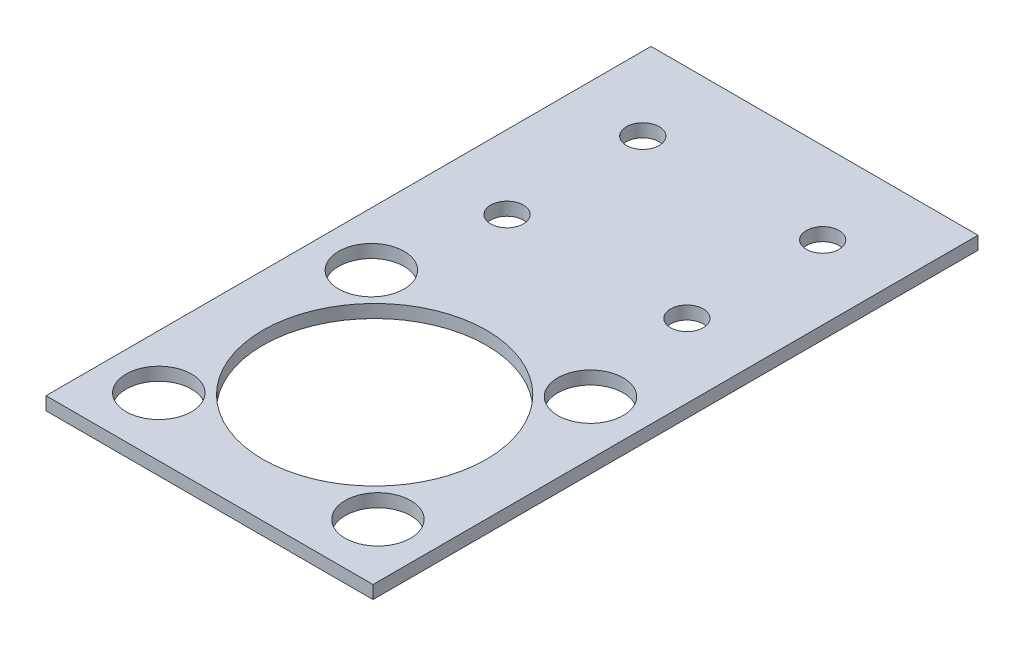
ISO-10303-21;
HEADER;
FILE_DESCRIPTION(('STEP AP214'),'2;1');
FILE_NAME('part.step','',(''),(''),'','','');
FILE_SCHEMA(('AUTOMOTIVE_DESIGN { 1 0 10303 214 1 1 1 1 }'));
ENDSEC;
DATA;
#1=APPLICATION_CONTEXT('core data for automotive mechanical design processes');
#2=APPLICATION_PROTOCOL_DEFINITION('international standard','automotive_design',2000,#1);
#3=PRODUCT_CONTEXT('',#1,'mechanical');
#4=PRODUCT('Part','Part','',(#3));
#5=PRODUCT_RELATED_PRODUCT_CATEGORY('part','',(#4));
#6=PRODUCT_DEFINITION_FORMATION('','',#4);
#7=PRODUCT_DEFINITION_CONTEXT('part definition',#1,'design');
#8=PRODUCT_DEFINITION('design','',#6,#7);
#9=PRODUCT_DEFINITION_SHAPE('','',#8);
#10=(LENGTH_UNIT() NAMED_UNIT(*) SI_UNIT(.MILLI.,.METRE.));
#11=(NAMED_UNIT(*) PLANE_ANGLE_UNIT() SI_UNIT($,.RADIAN.));
#12=(NAMED_UNIT(*) SI_UNIT($,.STERADIAN.) SOLID_ANGLE_UNIT());
#13=UNCERTAINTY_MEASURE_WITH_UNIT(LENGTH_MEASURE(1.E-05),#10,'distance_accuracy_value','');
#14=(GEOMETRIC_REPRESENTATION_CONTEXT(3) GLOBAL_UNCERTAINTY_ASSIGNED_CONTEXT((#13)) GLOBAL_UNIT_ASSIGNED_CONTEXT((#10,
#11,#12)) REPRESENTATION_CONTEXT('',''));
#15=CARTESIAN_POINT('',(0.,0.,0.));
#16=DIRECTION('',(0.,0.,1.));
#17=DIRECTION('',(1.,0.,0.));
#18=AXIS2_PLACEMENT_3D('',#15,#16,#17);
#19=CARTESIAN_POINT('',(0.,-2.,0.));
#20=DIRECTION('',(0.,1.,0.));
#21=DIRECTION('',(0.,0.,1.));
#22=AXIS2_PLACEMENT_3D('',#19,#20,#21);
#23=PLANE('',#22);
#24=CARTESIAN_POINT('',(-19.25,-2.,38.5));
#25=DIRECTION('',(0.,1.,0.));
#26=DIRECTION('',(0.,0.,1.));
#27=AXIS2_PLACEMENT_3D('',#24,#25,#26);
#28=CIRCLE('',#27,5.);
#29=CARTESIAN_POINT('',(-19.25,-2.,43.5));
#30=VERTEX_POINT('',#29);
#31=EDGE_CURVE('E243',#30,#30,#28,.T.);
#32=ORIENTED_EDGE('',*,*,#31,.T.);
#33=EDGE_LOOP('',(#32));
#34=FACE_BOUND('',#33,.T.);
#35=CARTESIAN_POINT('',(-2.50000000000001,-2.,22.25));
#36=DIRECTION('',(0.,1.,0.));
#37=DIRECTION('',(0.,0.,1.));
#38=AXIS2_PLACEMENT_3D('',#35,#36,#37);
#39=CIRCLE('',#38,17.1);
#40=CARTESIAN_POINT('',(-2.50000000000001,-2.,39.35));
#41=VERTEX_POINT('',#40);
#42=EDGE_CURVE('E230',#41,#41,#39,.T.);
#43=ORIENTED_EDGE('',*,*,#42,.T.);
#44=EDGE_LOOP('',(#43));
#45=FACE_BOUND('',#44,.T.);
#46=CARTESIAN_POINT('',(-16.25,-2.,-32.5));
#47=DIRECTION('',(0.,1.,0.));
#48=DIRECTION('',(0.,0.,1.));
#49=AXIS2_PLACEMENT_3D('',#46,#47,#48);
#50=CIRCLE('',#49,2.5);
#51=CARTESIAN_POINT('',(-16.25,-2.,-30.));
#52=VERTEX_POINT('',#51);
#53=EDGE_CURVE('E228',#52,#52,#50,.T.);
#54=ORIENTED_EDGE('',*,*,#53,.T.);
#55=EDGE_LOOP('',(#54));
#56=FACE_BOUND('',#55,.T.);
#57=CARTESIAN_POINT('',(14.25,-2.,5.99999999999999));
#58=DIRECTION('',(0.,1.,0.));
#59=DIRECTION('',(0.,0.,1.));
#60=AXIS2_PLACEMENT_3D('',#57,#58,#59);
#61=CIRCLE('',#60,5.);
#62=CARTESIAN_POINT('',(14.25,-2.,11.));
#63=VERTEX_POINT('',#62);
#64=EDGE_CURVE('E237',#63,#63,#61,.T.);
#65=ORIENTED_EDGE('',*,*,#64,.T.);
#66=EDGE_LOOP('',(#65));
#67=FACE_BOUND('',#66,.T.);
#68=CARTESIAN_POINT('',(-16.25,-2.,-11.74));
#69=DIRECTION('',(0.,1.,0.));
#70=DIRECTION('',(0.,0.,1.));
#71=AXIS2_PLACEMENT_3D('',#68,#69,#70);
#72=CIRCLE('',#71,2.5);
#73=CARTESIAN_POINT('',(-16.25,-2.,-9.23999999999999));
#74=VERTEX_POINT('',#73);
#75=EDGE_CURVE('E261',#74,#74,#72,.T.);
#76=ORIENTED_EDGE('',*,*,#75,.T.);
#77=EDGE_LOOP('',(#76));
#78=FACE_BOUND('',#77,.T.);
#79=DIRECTION('',(0.,0.,1.));
#80=VECTOR('',#79,1.);
#81=CARTESIAN_POINT('',(-27.5,-2.,-45.));
#82=LINE('',#81,#80);
#83=CARTESIAN_POINT('',(-27.5,-2.,-45.));
#84=VERTEX_POINT('',#83);
#85=CARTESIAN_POINT('',(-27.5,-2.,47.5));
#86=VERTEX_POINT('',#85);
#87=EDGE_CURVE('E146',#84,#86,#82,.T.);
#88=ORIENTED_EDGE('',*,*,#87,.F.);
#89=DIRECTION('',(-1.,0.,0.));
#90=VECTOR('',#89,1.);
#91=CARTESIAN_POINT('',(-27.5,-2.,-45.));
#92=LINE('',#91,#90);
#93=CARTESIAN_POINT('',(22.5,-2.,-45.));
#94=VERTEX_POINT('',#93);
#95=EDGE_CURVE('E143',#94,#84,#92,.T.);
#96=ORIENTED_EDGE('',*,*,#95,.F.);
#97=DIRECTION('',(0.,0.,-1.));
#98=VECTOR('',#97,1.);
#99=CARTESIAN_POINT('',(22.5,-2.,-45.));
#100=LINE('',#99,#98);
#101=CARTESIAN_POINT('',(22.5,-2.,47.5));
#102=VERTEX_POINT('',#101);
#103=EDGE_CURVE('E136',#102,#94,#100,.T.);
#104=ORIENTED_EDGE('',*,*,#103,.F.);
#105=DIRECTION('',(1.,0.,0.));
#106=VECTOR('',#105,1.);
#107=CARTESIAN_POINT('',(-27.5,-2.,47.5));
#108=LINE('',#107,#106);
#109=EDGE_CURVE('E142',#86,#102,#108,.T.);
#110=ORIENTED_EDGE('',*,*,#109,.F.);
#111=EDGE_LOOP('',(#88,#96,#104,#110));
#112=FACE_BOUND('',#111,.T.);
#113=CARTESIAN_POINT('',(-19.25,-2.,5.99999999999999));
#114=DIRECTION('',(0.,1.,0.));
#115=DIRECTION('',(0.,0.,1.));
#116=AXIS2_PLACEMENT_3D('',#113,#114,#115);
#117=CIRCLE('',#116,5.);
#118=CARTESIAN_POINT('',(-19.25,-2.,11.));
#119=VERTEX_POINT('',#118);
#120=EDGE_CURVE('E231',#119,#119,#117,.F.);
#121=ORIENTED_EDGE('',*,*,#120,.F.);
#122=EDGE_LOOP('',(#121));
#123=FACE_BOUND('',#122,.T.);
#124=CARTESIAN_POINT('',(14.25,-2.,38.5));
#125=DIRECTION('',(0.,1.,0.));
#126=DIRECTION('',(0.,0.,1.));
#127=AXIS2_PLACEMENT_3D('',#124,#125,#126);
#128=CIRCLE('',#127,5.);
#129=CARTESIAN_POINT('',(14.25,-2.,43.5));
#130=VERTEX_POINT('',#129);
#131=EDGE_CURVE('E234',#130,#130,#128,.F.);
#132=ORIENTED_EDGE('',*,*,#131,.F.);
#133=EDGE_LOOP('',(#132));
#134=FACE_BOUND('',#133,.T.);
#135=CARTESIAN_POINT('',(11.25,-2.,-32.5));
#136=DIRECTION('',(0.,1.,0.));
#137=DIRECTION('',(0.,0.,1.));
#138=AXIS2_PLACEMENT_3D('',#135,#136,#137);
#139=CIRCLE('',#138,2.5);
#140=CARTESIAN_POINT('',(11.25,-2.,-30.));
#141=VERTEX_POINT('',#140);
#142=EDGE_CURVE('E245',#141,#141,#139,.F.);
#143=ORIENTED_EDGE('',*,*,#142,.F.);
#144=EDGE_LOOP('',(#143));
#145=FACE_BOUND('',#144,.T.);
#146=CARTESIAN_POINT('',(11.25,-2.,-11.74));
#147=DIRECTION('',(0.,1.,0.));
#148=DIRECTION('',(0.,0.,1.));
#149=AXIS2_PLACEMENT_3D('',#146,#147,#148);
#150=CIRCLE('',#149,2.5);
#151=CARTESIAN_POINT('',(11.25,-2.,-9.23999999999996));
#152=VERTEX_POINT('',#151);
#153=EDGE_CURVE('E157',#152,#152,#150,.F.);
#154=ORIENTED_EDGE('',*,*,#153,.F.);
#155=EDGE_LOOP('',(#154));
#156=FACE_BOUND('',#155,.T.);
#157=ADVANCED_FACE('F87',(#34,#45,#56,#67,#78,#112,#123,#134,#145,#156),#23,.F.);
#158=CARTESIAN_POINT('',(0.,0.,0.));
#159=DIRECTION('',(0.,1.,0.));
#160=DIRECTION('',(0.,0.,1.));
#161=AXIS2_PLACEMENT_3D('',#158,#159,#160);
#162=PLANE('',#161);
#163=CARTESIAN_POINT('',(11.25,0.,-32.5));
#164=DIRECTION('',(0.,1.,0.));
#165=DIRECTION('',(0.,0.,1.));
#166=AXIS2_PLACEMENT_3D('',#163,#164,#165);
#167=CIRCLE('',#166,2.5);
#168=CARTESIAN_POINT('',(11.25,0.,-30.));
#169=VERTEX_POINT('',#168);
#170=EDGE_CURVE('E275',#169,#169,#167,.F.);
#171=ORIENTED_EDGE('',*,*,#170,.T.);
#172=EDGE_LOOP('',(#171));
#173=FACE_BOUND('',#172,.T.);
#174=CARTESIAN_POINT('',(-19.25,0.,38.5));
#175=DIRECTION('',(0.,1.,0.));
#176=DIRECTION('',(0.,0.,1.));
#177=AXIS2_PLACEMENT_3D('',#174,#175,#176);
#178=CIRCLE('',#177,5.);
#179=CARTESIAN_POINT('',(-19.25,0.,43.5));
#180=VERTEX_POINT('',#179);
#181=EDGE_CURVE('E271',#180,#180,#178,.T.);
#182=ORIENTED_EDGE('',*,*,#181,.F.);
#183=EDGE_LOOP('',(#182));
#184=FACE_BOUND('',#183,.T.);
#185=CARTESIAN_POINT('',(-19.25,0.,5.99999999999999));
#186=DIRECTION('',(0.,-1.,0.));
#187=DIRECTION('',(0.,0.,-1.));
#188=AXIS2_PLACEMENT_3D('',#185,#186,#187);
#189=CIRCLE('',#188,5.);
#190=CARTESIAN_POINT('',(-19.25,0.,0.99999999999999));
#191=VERTEX_POINT('',#190);
#192=EDGE_CURVE('E280',#191,#191,#189,.T.);
#193=ORIENTED_EDGE('',*,*,#192,.T.);
#194=EDGE_LOOP('',(#193));
#195=FACE_BOUND('',#194,.T.);
#196=CARTESIAN_POINT('',(14.25,0.,5.99999999999999));
#197=DIRECTION('',(0.,1.,0.));
#198=DIRECTION('',(0.,0.,1.));
#199=AXIS2_PLACEMENT_3D('',#196,#197,#198);
#200=CIRCLE('',#199,5.);
#201=CARTESIAN_POINT('',(14.25,0.,11.));
#202=VERTEX_POINT('',#201);
#203=EDGE_CURVE('E272',#202,#202,#200,.T.);
#204=ORIENTED_EDGE('',*,*,#203,.F.);
#205=EDGE_LOOP('',(#204));
#206=FACE_BOUND('',#205,.T.);
#207=CARTESIAN_POINT('',(-16.25,0.,-11.74));
#208=DIRECTION('',(0.,1.,0.));
#209=DIRECTION('',(0.,0.,1.));
#210=AXIS2_PLACEMENT_3D('',#207,#208,#209);
#211=CIRCLE('',#210,2.5);
#212=CARTESIAN_POINT('',(-16.25,0.,-9.23999999999999));
#213=VERTEX_POINT('',#212);
#214=EDGE_CURVE('E264',#213,#213,#211,.T.);
#215=ORIENTED_EDGE('',*,*,#214,.F.);
#216=EDGE_LOOP('',(#215));
#217=FACE_BOUND('',#216,.T.);
#218=DIRECTION('',(0.,0.,1.));
#219=VECTOR('',#218,1.);
#220=CARTESIAN_POINT('',(-27.5,0.,-45.));
#221=LINE('',#220,#219);
#222=CARTESIAN_POINT('',(-27.5,0.,-45.));
#223=VERTEX_POINT('',#222);
#224=CARTESIAN_POINT('',(-27.5,0.,47.5));
#225=VERTEX_POINT('',#224);
#226=EDGE_CURVE('E153',#223,#225,#221,.T.);
#227=ORIENTED_EDGE('',*,*,#226,.T.);
#228=DIRECTION('',(1.,0.,0.));
#229=VECTOR('',#228,1.);
#230=CARTESIAN_POINT('',(-27.5,0.,47.5));
#231=LINE('',#230,#229);
#232=CARTESIAN_POINT('',(22.5,0.,47.5));
#233=VERTEX_POINT('',#232);
#234=EDGE_CURVE('E156',#225,#233,#231,.T.);
#235=ORIENTED_EDGE('',*,*,#234,.T.);
#236=DIRECTION('',(0.,0.,-1.));
#237=VECTOR('',#236,1.);
#238=CARTESIAN_POINT('',(22.5,0.,-45.));
#239=LINE('',#238,#237);
#240=CARTESIAN_POINT('',(22.5,0.,-45.));
#241=VERTEX_POINT('',#240);
#242=EDGE_CURVE('E138',#233,#241,#239,.T.);
#243=ORIENTED_EDGE('',*,*,#242,.T.);
#244=DIRECTION('',(-1.,0.,0.));
#245=VECTOR('',#244,1.);
#246=CARTESIAN_POINT('',(-27.5,0.,-45.));
#247=LINE('',#246,#245);
#248=EDGE_CURVE('E148',#241,#223,#247,.T.);
#249=ORIENTED_EDGE('',*,*,#248,.T.);
#250=EDGE_LOOP('',(#227,#235,#243,#249));
#251=FACE_BOUND('',#250,.T.);
#252=CARTESIAN_POINT('',(-16.25,0.,-32.5));
#253=DIRECTION('',(0.,1.,0.));
#254=DIRECTION('',(0.,0.,1.));
#255=AXIS2_PLACEMENT_3D('',#252,#253,#254);
#256=CIRCLE('',#255,2.5);
#257=CARTESIAN_POINT('',(-16.25,0.,-30.));
#258=VERTEX_POINT('',#257);
#259=EDGE_CURVE('E225',#258,#258,#256,.T.);
#260=ORIENTED_EDGE('',*,*,#259,.F.);
#261=EDGE_LOOP('',(#260));
#262=FACE_BOUND('',#261,.T.);
#263=CARTESIAN_POINT('',(-2.50000000000001,0.,22.25));
#264=DIRECTION('',(0.,1.,0.));
#265=DIRECTION('',(0.,0.,1.));
#266=AXIS2_PLACEMENT_3D('',#263,#264,#265);
#267=CIRCLE('',#266,17.1);
#268=CARTESIAN_POINT('',(-2.50000000000001,0.,39.35));
#269=VERTEX_POINT('',#268);
#270=EDGE_CURVE('E285',#269,#269,#267,.T.);
#271=ORIENTED_EDGE('',*,*,#270,.F.);
#272=EDGE_LOOP('',(#271));
#273=FACE_BOUND('',#272,.T.);
#274=CARTESIAN_POINT('',(14.25,0.,38.5));
#275=DIRECTION('',(0.,-1.,0.));
#276=DIRECTION('',(0.,0.,-1.));
#277=AXIS2_PLACEMENT_3D('',#274,#275,#276);
#278=CIRCLE('',#277,5.);
#279=CARTESIAN_POINT('',(14.25,0.,33.5));
#280=VERTEX_POINT('',#279);
#281=EDGE_CURVE('E268',#280,#280,#278,.T.);
#282=ORIENTED_EDGE('',*,*,#281,.T.);
#283=EDGE_LOOP('',(#282));
#284=FACE_BOUND('',#283,.T.);
#285=CARTESIAN_POINT('',(11.25,0.,-11.74));
#286=DIRECTION('',(0.,1.,0.));
#287=DIRECTION('',(0.,0.,1.));
#288=AXIS2_PLACEMENT_3D('',#285,#286,#287);
#289=CIRCLE('',#288,2.5);
#290=CARTESIAN_POINT('',(11.25,0.,-9.23999999999996));
#291=VERTEX_POINT('',#290);
#292=EDGE_CURVE('E267',#291,#291,#289,.F.);
#293=ORIENTED_EDGE('',*,*,#292,.T.);
#294=EDGE_LOOP('',(#293));
#295=FACE_BOUND('',#294,.T.);
#296=ADVANCED_FACE('F163',(#173,#184,#195,#206,#217,#251,#262,#273,#284,#295),#162,.T.);
#297=CARTESIAN_POINT('',(-27.5,-2.,-45.));
#298=DIRECTION('',(-1.,0.,0.));
#299=DIRECTION('',(0.,0.,1.));
#300=AXIS2_PLACEMENT_3D('',#297,#298,#299);
#301=PLANE('',#300);
#302=ORIENTED_EDGE('',*,*,#226,.F.);
#303=DIRECTION('',(0.,1.,0.));
#304=VECTOR('',#303,1.);
#305=CARTESIAN_POINT('',(-27.5,-2.,-45.));
#306=LINE('',#305,#304);
#307=EDGE_CURVE('E12',#84,#223,#306,.T.);
#308=ORIENTED_EDGE('',*,*,#307,.F.);
#309=ORIENTED_EDGE('',*,*,#87,.T.);
#310=DIRECTION('',(0.,1.,0.));
#311=VECTOR('',#310,1.);
#312=CARTESIAN_POINT('',(-27.5,-2.,47.5));
#313=LINE('',#312,#311);
#314=EDGE_CURVE('E91',#86,#225,#313,.T.);
#315=ORIENTED_EDGE('',*,*,#314,.T.);
#316=EDGE_LOOP('',(#302,#308,#309,#315));
#317=FACE_BOUND('',#316,.T.);
#318=ADVANCED_FACE('F89',(#317),#301,.T.);
#319=CARTESIAN_POINT('',(-27.5,-2.,-45.));
#320=DIRECTION('',(0.,0.,-1.));
#321=DIRECTION('',(-1.,0.,0.));
#322=AXIS2_PLACEMENT_3D('',#319,#320,#321);
#323=PLANE('',#322);
#324=ORIENTED_EDGE('',*,*,#248,.F.);
#325=DIRECTION('',(0.,1.,0.));
#326=VECTOR('',#325,1.);
#327=CARTESIAN_POINT('',(22.5,-2.,-45.));
#328=LINE('',#327,#326);
#329=EDGE_CURVE('E97',#94,#241,#328,.T.);
#330=ORIENTED_EDGE('',*,*,#329,.F.);
#331=ORIENTED_EDGE('',*,*,#95,.T.);
#332=ORIENTED_EDGE('',*,*,#307,.T.);
#333=EDGE_LOOP('',(#324,#330,#331,#332));
#334=FACE_BOUND('',#333,.T.);
#335=ADVANCED_FACE('F165',(#334),#323,.T.);
#336=CARTESIAN_POINT('',(22.5,-2.,-45.));
#337=DIRECTION('',(1.,0.,0.));
#338=DIRECTION('',(0.,0.,-1.));
#339=AXIS2_PLACEMENT_3D('',#336,#337,#338);
#340=PLANE('',#339);
#341=ORIENTED_EDGE('',*,*,#242,.F.);
#342=DIRECTION('',(0.,1.,0.));
#343=VECTOR('',#342,1.);
#344=CARTESIAN_POINT('',(22.5,-2.,47.5));
#345=LINE('',#344,#343);
#346=EDGE_CURVE('E133',#102,#233,#345,.T.);
#347=ORIENTED_EDGE('',*,*,#346,.F.);
#348=ORIENTED_EDGE('',*,*,#103,.T.);
#349=ORIENTED_EDGE('',*,*,#329,.T.);
#350=EDGE_LOOP('',(#341,#347,#348,#349));
#351=FACE_BOUND('',#350,.T.);
#352=ADVANCED_FACE('F135',(#351),#340,.T.);
#353=CARTESIAN_POINT('',(-27.5,-2.,47.5));
#354=DIRECTION('',(0.,0.,1.));
#355=DIRECTION('',(1.,0.,0.));
#356=AXIS2_PLACEMENT_3D('',#353,#354,#355);
#357=PLANE('',#356);
#358=ORIENTED_EDGE('',*,*,#234,.F.);
#359=ORIENTED_EDGE('',*,*,#314,.F.);
#360=ORIENTED_EDGE('',*,*,#109,.T.);
#361=ORIENTED_EDGE('',*,*,#346,.T.);
#362=EDGE_LOOP('',(#358,#359,#360,#361));
#363=FACE_BOUND('',#362,.T.);
#364=ADVANCED_FACE('F145',(#363),#357,.T.);
#365=CARTESIAN_POINT('',(-16.25,-10.,-11.74));
#366=DIRECTION('',(0.,1.,0.));
#367=DIRECTION('',(0.,0.,1.));
#368=AXIS2_PLACEMENT_3D('',#365,#366,#367);
#369=CYLINDRICAL_SURFACE('',#368,2.5);
#370=ORIENTED_EDGE('',*,*,#214,.T.);
#371=EDGE_LOOP('',(#370));
#372=FACE_BOUND('',#371,.T.);
#373=ORIENTED_EDGE('',*,*,#75,.F.);
#374=EDGE_LOOP('',(#373));
#375=FACE_BOUND('',#374,.T.);
#376=ADVANCED_FACE('F185',(#372,#375),#369,.F.);
#377=CARTESIAN_POINT('',(14.25,-10.,5.99999999999999));
#378=DIRECTION('',(0.,1.,0.));
#379=DIRECTION('',(0.,0.,1.));
#380=AXIS2_PLACEMENT_3D('',#377,#378,#379);
#381=CYLINDRICAL_SURFACE('',#380,5.);
#382=ORIENTED_EDGE('',*,*,#203,.T.);
#383=EDGE_LOOP('',(#382));
#384=FACE_BOUND('',#383,.T.);
#385=ORIENTED_EDGE('',*,*,#64,.F.);
#386=EDGE_LOOP('',(#385));
#387=FACE_BOUND('',#386,.T.);
#388=ADVANCED_FACE('F188',(#384,#387),#381,.F.);
#389=CARTESIAN_POINT('',(-19.25,-10.,5.99999999999999));
#390=DIRECTION('',(0.,1.,0.));
#391=DIRECTION('',(0.,0.,1.));
#392=AXIS2_PLACEMENT_3D('',#389,#390,#391);
#393=CYLINDRICAL_SURFACE('',#392,5.);
#394=ORIENTED_EDGE('',*,*,#192,.F.);
#395=EDGE_LOOP('',(#394));
#396=FACE_BOUND('',#395,.T.);
#397=ORIENTED_EDGE('',*,*,#120,.T.);
#398=EDGE_LOOP('',(#397));
#399=FACE_BOUND('',#398,.T.);
#400=ADVANCED_FACE('F207',(#396,#399),#393,.F.);
#401=CARTESIAN_POINT('',(-16.25,-10.,-32.5));
#402=DIRECTION('',(0.,1.,0.));
#403=DIRECTION('',(0.,0.,1.));
#404=AXIS2_PLACEMENT_3D('',#401,#402,#403);
#405=CYLINDRICAL_SURFACE('',#404,2.5);
#406=ORIENTED_EDGE('',*,*,#259,.T.);
#407=EDGE_LOOP('',(#406));
#408=FACE_BOUND('',#407,.T.);
#409=ORIENTED_EDGE('',*,*,#53,.F.);
#410=EDGE_LOOP('',(#409));
#411=FACE_BOUND('',#410,.T.);
#412=ADVANCED_FACE('F210',(#408,#411),#405,.F.);
#413=CARTESIAN_POINT('',(-2.50000000000001,-10.,22.25));
#414=DIRECTION('',(0.,1.,0.));
#415=DIRECTION('',(0.,0.,1.));
#416=AXIS2_PLACEMENT_3D('',#413,#414,#415);
#417=CYLINDRICAL_SURFACE('',#416,17.1);
#418=ORIENTED_EDGE('',*,*,#270,.T.);
#419=EDGE_LOOP('',(#418));
#420=FACE_BOUND('',#419,.T.);
#421=ORIENTED_EDGE('',*,*,#42,.F.);
#422=EDGE_LOOP('',(#421));
#423=FACE_BOUND('',#422,.T.);
#424=ADVANCED_FACE('F194',(#420,#423),#417,.F.);
#425=CARTESIAN_POINT('',(14.25,-10.,38.5));
#426=DIRECTION('',(0.,1.,0.));
#427=DIRECTION('',(0.,0.,1.));
#428=AXIS2_PLACEMENT_3D('',#425,#426,#427);
#429=CYLINDRICAL_SURFACE('',#428,5.);
#430=ORIENTED_EDGE('',*,*,#281,.F.);
#431=EDGE_LOOP('',(#430));
#432=FACE_BOUND('',#431,.T.);
#433=ORIENTED_EDGE('',*,*,#131,.T.);
#434=EDGE_LOOP('',(#433));
#435=FACE_BOUND('',#434,.T.);
#436=ADVANCED_FACE('F190',(#432,#435),#429,.F.);
#437=CARTESIAN_POINT('',(-19.25,-10.,38.5));
#438=DIRECTION('',(0.,1.,0.));
#439=DIRECTION('',(0.,0.,1.));
#440=AXIS2_PLACEMENT_3D('',#437,#438,#439);
#441=CYLINDRICAL_SURFACE('',#440,5.);
#442=ORIENTED_EDGE('',*,*,#181,.T.);
#443=EDGE_LOOP('',(#442));
#444=FACE_BOUND('',#443,.T.);
#445=ORIENTED_EDGE('',*,*,#31,.F.);
#446=EDGE_LOOP('',(#445));
#447=FACE_BOUND('',#446,.T.);
#448=ADVANCED_FACE('F193',(#444,#447),#441,.F.);
#449=CARTESIAN_POINT('',(11.25,-10.,-32.5));
#450=DIRECTION('',(0.,1.,0.));
#451=DIRECTION('',(0.,0.,1.));
#452=AXIS2_PLACEMENT_3D('',#449,#450,#451);
#453=CYLINDRICAL_SURFACE('',#452,2.5);
#454=ORIENTED_EDGE('',*,*,#170,.F.);
#455=EDGE_LOOP('',(#454));
#456=FACE_BOUND('',#455,.T.);
#457=ORIENTED_EDGE('',*,*,#142,.T.);
#458=EDGE_LOOP('',(#457));
#459=FACE_BOUND('',#458,.T.);
#460=ADVANCED_FACE('F198',(#456,#459),#453,.F.);
#461=CARTESIAN_POINT('',(11.25,-10.,-11.74));
#462=DIRECTION('',(0.,1.,0.));
#463=DIRECTION('',(0.,0.,1.));
#464=AXIS2_PLACEMENT_3D('',#461,#462,#463);
#465=CYLINDRICAL_SURFACE('',#464,2.5);
#466=ORIENTED_EDGE('',*,*,#292,.F.);
#467=EDGE_LOOP('',(#466));
#468=FACE_BOUND('',#467,.T.);
#469=ORIENTED_EDGE('',*,*,#153,.T.);
#470=EDGE_LOOP('',(#469));
#471=FACE_BOUND('',#470,.T.);
#472=ADVANCED_FACE('F202',(#468,#471),#465,.F.);
#473=CLOSED_SHELL('',(#157,#296,#318,#335,#352,#364,#376,#388,#400,#412,#424,#436,#448,#460,#472));
#474=MANIFOLD_SOLID_BREP('B2',#473);
#475=ADVANCED_BREP_SHAPE_REPRESENTATION('',(#18,#474),#14);
#476=SHAPE_DEFINITION_REPRESENTATION(#9,#475);
ENDSEC;
END-ISO-10303-21;
